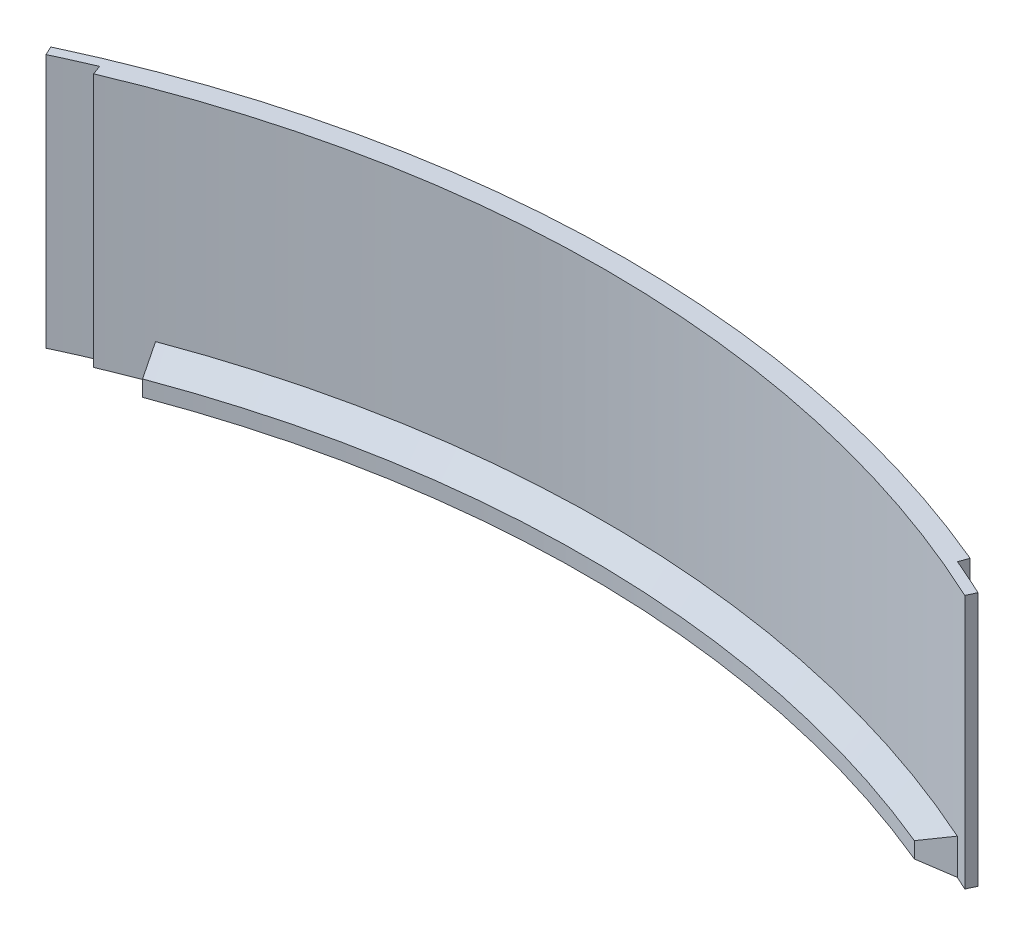
ISO-10303-21;
HEADER;
FILE_DESCRIPTION(('STEP AP214'),'2;1');
FILE_NAME('part.step','',(''),(''),'','','');
FILE_SCHEMA(('AUTOMOTIVE_DESIGN { 1 0 10303 214 1 1 1 1 }'));
ENDSEC;
DATA;
#1=APPLICATION_CONTEXT('core data for automotive mechanical design processes');
#2=APPLICATION_PROTOCOL_DEFINITION('international standard','automotive_design',2000,#1);
#3=PRODUCT_CONTEXT('',#1,'mechanical');
#4=PRODUCT('Part','Part','',(#3));
#5=PRODUCT_RELATED_PRODUCT_CATEGORY('part','',(#4));
#6=PRODUCT_DEFINITION_FORMATION('','',#4);
#7=PRODUCT_DEFINITION_CONTEXT('part definition',#1,'design');
#8=PRODUCT_DEFINITION('design','',#6,#7);
#9=PRODUCT_DEFINITION_SHAPE('','',#8);
#10=(LENGTH_UNIT() NAMED_UNIT(*) SI_UNIT(.MILLI.,.METRE.));
#11=(NAMED_UNIT(*) PLANE_ANGLE_UNIT() SI_UNIT($,.RADIAN.));
#12=(NAMED_UNIT(*) SI_UNIT($,.STERADIAN.) SOLID_ANGLE_UNIT());
#13=UNCERTAINTY_MEASURE_WITH_UNIT(LENGTH_MEASURE(1.E-05),#10,'distance_accuracy_value','');
#14=(GEOMETRIC_REPRESENTATION_CONTEXT(3) GLOBAL_UNCERTAINTY_ASSIGNED_CONTEXT((#13)) GLOBAL_UNIT_ASSIGNED_CONTEXT((#10,
#11,#12)) REPRESENTATION_CONTEXT('',''));
#15=CARTESIAN_POINT('',(0.,0.,0.));
#16=DIRECTION('',(0.,0.,1.));
#17=DIRECTION('',(1.,0.,0.));
#18=AXIS2_PLACEMENT_3D('',#15,#16,#17);
#19=CARTESIAN_POINT('',(0.,16.,-0.655417058189309));
#20=DIRECTION('',(0.,-1.,0.));
#21=DIRECTION('',(0.,0.,-1.));
#22=AXIS2_PLACEMENT_3D('',#19,#20,#21);
#23=CYLINDRICAL_SURFACE('',#22,138.155417058189);
#24=CARTESIAN_POINT('',(0.,-16.,-0.655417058189309));
#25=DIRECTION('',(0.,-1.,0.));
#26=DIRECTION('',(0.,0.,-1.));
#27=AXIS2_PLACEMENT_3D('',#24,#25,#26);
#28=CIRCLE('',#27,138.155417058189);
#29=CARTESIAN_POINT('',(-58.6379241549536,-16.,-125.749434154612));
#30=VERTEX_POINT('',#29);
#31=CARTESIAN_POINT('',(-53.9719536652918,-16.,-127.832252527837));
#32=VERTEX_POINT('',#31);
#33=EDGE_CURVE('E215',#30,#32,#28,.T.);
#34=ORIENTED_EDGE('',*,*,#33,.T.);
#35=DIRECTION('',(0.,-1.,0.));
#36=VECTOR('',#35,1.);
#37=CARTESIAN_POINT('',(-53.9719536652918,16.,-127.832252527837));
#38=LINE('',#37,#36);
#39=CARTESIAN_POINT('',(-53.9719536652918,16.,-127.832252527837));
#40=VERTEX_POINT('',#39);
#41=EDGE_CURVE('E272',#40,#32,#38,.T.);
#42=ORIENTED_EDGE('',*,*,#41,.F.);
#43=CARTESIAN_POINT('',(0.,16.,-0.655417058189309));
#44=DIRECTION('',(0.,-1.,0.));
#45=DIRECTION('',(0.,0.,-1.));
#46=AXIS2_PLACEMENT_3D('',#43,#44,#45);
#47=CIRCLE('',#46,138.155417058189);
#48=CARTESIAN_POINT('',(-58.6379241549536,16.,-125.749434154612));
#49=VERTEX_POINT('',#48);
#50=EDGE_CURVE('E216',#49,#40,#47,.T.);
#51=ORIENTED_EDGE('',*,*,#50,.F.);
#52=DIRECTION('',(0.,-1.,0.));
#53=VECTOR('',#52,1.);
#54=CARTESIAN_POINT('',(-58.6379241549536,16.,-125.749434154612));
#55=LINE('',#54,#53);
#56=EDGE_CURVE('E234',#49,#30,#55,.T.);
#57=ORIENTED_EDGE('',*,*,#56,.T.);
#58=EDGE_LOOP('',(#34,#42,#51,#57));
#59=FACE_BOUND('',#58,.T.);
#60=ADVANCED_FACE('F37',(#59),#23,.F.);
#61=CARTESIAN_POINT('',(-53.9719536652918,16.,-127.832252527837));
#62=DIRECTION('',(0.939692620785906,0.,-0.342020143325674));
#63=DIRECTION('',(-0.342020143325674,0.,-0.939692620785906));
#64=AXIS2_PLACEMENT_3D('',#61,#62,#63);
#65=PLANE('',#64);
#66=DIRECTION('',(0.342020143325674,0.,0.939692620785906));
#67=VECTOR('',#66,1.);
#68=CARTESIAN_POINT('',(-53.9719536652918,-16.,-127.832252527837));
#69=LINE('',#68,#67);
#70=CARTESIAN_POINT('',(-53.5408012887989,-16.,-126.647671109079));
#71=VERTEX_POINT('',#70);
#72=EDGE_CURVE('E237',#32,#71,#69,.T.);
#73=ORIENTED_EDGE('',*,*,#72,.T.);
#74=DIRECTION('',(0.,-1.,0.));
#75=VECTOR('',#74,1.);
#76=CARTESIAN_POINT('',(-53.5408012887989,16.,-126.647671109079));
#77=LINE('',#76,#75);
#78=CARTESIAN_POINT('',(-53.5408012887989,16.,-126.647671109079));
#79=VERTEX_POINT('',#78);
#80=EDGE_CURVE('E270',#79,#71,#77,.T.);
#81=ORIENTED_EDGE('',*,*,#80,.F.);
#82=DIRECTION('',(0.342020143325674,0.,0.939692620785906));
#83=VECTOR('',#82,1.);
#84=CARTESIAN_POINT('',(-53.9719536652918,16.,-127.832252527837));
#85=LINE('',#84,#83);
#86=EDGE_CURVE('E219',#40,#79,#85,.T.);
#87=ORIENTED_EDGE('',*,*,#86,.F.);
#88=ORIENTED_EDGE('',*,*,#41,.T.);
#89=EDGE_LOOP('',(#73,#81,#87,#88));
#90=FACE_BOUND('',#89,.T.);
#91=ADVANCED_FACE('F297',(#90),#65,.F.);
#92=CARTESIAN_POINT('',(0.,16.,0.));
#93=DIRECTION('',(0.,-1.,0.));
#94=DIRECTION('',(0.,0.,-1.));
#95=AXIS2_PLACEMENT_3D('',#92,#93,#94);
#96=CYLINDRICAL_SURFACE('',#95,137.5);
#97=DIRECTION('',(0.,-1.,0.));
#98=VECTOR('',#97,1.);
#99=CARTESIAN_POINT('',(-47.9655484846176,-14.,-128.862547540276));
#100=LINE('',#99,#98);
#101=CARTESIAN_POINT('',(-47.9655484846176,-11.5,-128.862547540276));
#102=VERTEX_POINT('',#101);
#103=CARTESIAN_POINT('',(-47.9655484846176,-16.,-128.862547540276));
#104=VERTEX_POINT('',#103);
#105=EDGE_CURVE('E179',#102,#104,#100,.T.);
#106=ORIENTED_EDGE('',*,*,#105,.F.);
#107=CARTESIAN_POINT('',(0.,-11.5,0.));
#108=DIRECTION('',(0.,-1.,0.));
#109=DIRECTION('',(0.,0.,-1.));
#110=AXIS2_PLACEMENT_3D('',#107,#108,#109);
#111=CIRCLE('',#110,137.5);
#112=CARTESIAN_POINT('',(56.3667257732418,-11.5,-125.415478413169));
#113=VERTEX_POINT('',#112);
#114=EDGE_CURVE('E165',#102,#113,#111,.T.);
#115=ORIENTED_EDGE('',*,*,#114,.T.);
#116=DIRECTION('',(0.,-1.,0.));
#117=VECTOR('',#116,1.);
#118=CARTESIAN_POINT('',(56.3667257732418,16.,-125.415478413169));
#119=LINE('',#118,#117);
#120=CARTESIAN_POINT('',(56.3667257732418,-16.,-125.415478413169));
#121=VERTEX_POINT('',#120);
#122=EDGE_CURVE('E212',#113,#121,#119,.T.);
#123=ORIENTED_EDGE('',*,*,#122,.T.);
#124=CARTESIAN_POINT('',(0.,-16.,0.));
#125=DIRECTION('',(0.,-1.,0.));
#126=DIRECTION('',(0.,0.,1.));
#127=AXIS2_PLACEMENT_3D('',#124,#125,#126);
#128=CIRCLE('',#127,137.5);
#129=CARTESIAN_POINT('',(58.1100109893463,-16.,-124.617320717539));
#130=VERTEX_POINT('',#129);
#131=EDGE_CURVE('E240',#121,#130,#128,.T.);
#132=ORIENTED_EDGE('',*,*,#131,.T.);
#133=DIRECTION('',(0.,-1.,0.));
#134=VECTOR('',#133,1.);
#135=CARTESIAN_POINT('',(58.1100109893463,16.,-124.617320717539));
#136=LINE('',#135,#134);
#137=CARTESIAN_POINT('',(58.1100109893463,16.,-124.617320717539));
#138=VERTEX_POINT('',#137);
#139=EDGE_CURVE('E267',#138,#130,#136,.T.);
#140=ORIENTED_EDGE('',*,*,#139,.F.);
#141=CARTESIAN_POINT('',(0.,16.,0.));
#142=DIRECTION('',(0.,-1.,0.));
#143=DIRECTION('',(0.,0.,1.));
#144=AXIS2_PLACEMENT_3D('',#141,#142,#143);
#145=CIRCLE('',#144,137.5);
#146=EDGE_CURVE('E222',#79,#138,#145,.T.);
#147=ORIENTED_EDGE('',*,*,#146,.F.);
#148=ORIENTED_EDGE('',*,*,#80,.T.);
#149=EDGE_CURVE('E241',#71,#104,#128,.T.);
#150=ORIENTED_EDGE('',*,*,#149,.T.);
#151=EDGE_LOOP('',(#106,#115,#123,#132,#140,#147,#148,#150));
#152=FACE_BOUND('',#151,.T.);
#153=ADVANCED_FACE('F301',(#152),#96,.F.);
#154=CARTESIAN_POINT('',(58.1100109893463,16.,-124.617320717539));
#155=DIRECTION('',(-0.906307787036644,0.,-0.422618261740712));
#156=DIRECTION('',(-0.422618261740712,0.,0.906307787036644));
#157=AXIS2_PLACEMENT_3D('',#154,#155,#156);
#158=PLANE('',#157);
#159=DIRECTION('',(0.422618261740712,0.,-0.906307787036644));
#160=VECTOR('',#159,1.);
#161=CARTESIAN_POINT('',(58.1100109893463,-16.,-124.617320717539));
#162=LINE('',#161,#160);
#163=CARTESIAN_POINT('',(58.6379241549536,-16.,-125.749434154612));
#164=VERTEX_POINT('',#163);
#165=EDGE_CURVE('E243',#130,#164,#162,.T.);
#166=ORIENTED_EDGE('',*,*,#165,.T.);
#167=DIRECTION('',(0.,-1.,0.));
#168=VECTOR('',#167,1.);
#169=CARTESIAN_POINT('',(58.6379241549536,16.,-125.749434154612));
#170=LINE('',#169,#168);
#171=CARTESIAN_POINT('',(58.6379241549536,16.,-125.749434154612));
#172=VERTEX_POINT('',#171);
#173=EDGE_CURVE('E265',#172,#164,#170,.T.);
#174=ORIENTED_EDGE('',*,*,#173,.F.);
#175=DIRECTION('',(0.422618261740712,0.,-0.906307787036644));
#176=VECTOR('',#175,1.);
#177=CARTESIAN_POINT('',(58.1100109893463,16.,-124.617320717539));
#178=LINE('',#177,#176);
#179=EDGE_CURVE('E224',#138,#172,#178,.T.);
#180=ORIENTED_EDGE('',*,*,#179,.F.);
#181=ORIENTED_EDGE('',*,*,#139,.T.);
#182=EDGE_LOOP('',(#166,#174,#180,#181));
#183=FACE_BOUND('',#182,.T.);
#184=ADVANCED_FACE('F305',(#183),#158,.F.);
#185=CARTESIAN_POINT('',(0.,16.,-0.655417058189309));
#186=DIRECTION('',(0.,-1.,0.));
#187=DIRECTION('',(0.,0.,-1.));
#188=AXIS2_PLACEMENT_3D('',#185,#186,#187);
#189=CYLINDRICAL_SURFACE('',#188,138.155417058189);
#190=CARTESIAN_POINT('',(0.,-16.,-0.655417058189309));
#191=DIRECTION('',(0.,1.,0.));
#192=DIRECTION('',(0.,0.,-1.));
#193=AXIS2_PLACEMENT_3D('',#190,#191,#192);
#194=CIRCLE('',#193,138.155417058189);
#195=CARTESIAN_POINT('',(53.9719536652918,-16.,-127.832252527837));
#196=VERTEX_POINT('',#195);
#197=EDGE_CURVE('E246',#164,#196,#194,.T.);
#198=ORIENTED_EDGE('',*,*,#197,.T.);
#199=DIRECTION('',(0.,-1.,0.));
#200=VECTOR('',#199,1.);
#201=CARTESIAN_POINT('',(53.9719536652918,16.,-127.832252527837));
#202=LINE('',#201,#200);
#203=CARTESIAN_POINT('',(53.9719536652918,16.,-127.832252527837));
#204=VERTEX_POINT('',#203);
#205=EDGE_CURVE('E263',#204,#196,#202,.T.);
#206=ORIENTED_EDGE('',*,*,#205,.F.);
#207=CARTESIAN_POINT('',(0.,16.,-0.655417058189309));
#208=DIRECTION('',(0.,1.,0.));
#209=DIRECTION('',(0.,0.,-1.));
#210=AXIS2_PLACEMENT_3D('',#207,#208,#209);
#211=CIRCLE('',#210,138.155417058189);
#212=EDGE_CURVE('E226',#172,#204,#211,.T.);
#213=ORIENTED_EDGE('',*,*,#212,.F.);
#214=ORIENTED_EDGE('',*,*,#173,.T.);
#215=EDGE_LOOP('',(#198,#206,#213,#214));
#216=FACE_BOUND('',#215,.T.);
#217=ADVANCED_FACE('F309',(#216),#189,.T.);
#218=CARTESIAN_POINT('',(53.9719536652918,16.,-127.832252527837));
#219=DIRECTION('',(-0.939692620785907,0.,-0.342020143325673));
#220=DIRECTION('',(-0.342020143325673,0.,0.939692620785907));
#221=AXIS2_PLACEMENT_3D('',#218,#219,#220);
#222=PLANE('',#221);
#223=DIRECTION('',(0.342020143325673,0.,-0.939692620785907));
#224=VECTOR('',#223,1.);
#225=CARTESIAN_POINT('',(53.9719536652918,-16.,-127.832252527837));
#226=LINE('',#225,#224);
#227=CARTESIAN_POINT('',(54.3969406775952,-16.,-128.999894747702));
#228=VERTEX_POINT('',#227);
#229=EDGE_CURVE('E249',#196,#228,#226,.T.);
#230=ORIENTED_EDGE('',*,*,#229,.T.);
#231=DIRECTION('',(0.,-1.,0.));
#232=VECTOR('',#231,1.);
#233=CARTESIAN_POINT('',(54.3969406775952,16.,-128.999894747702));
#234=LINE('',#233,#232);
#235=CARTESIAN_POINT('',(54.3969406775952,16.,-128.999894747702));
#236=VERTEX_POINT('',#235);
#237=EDGE_CURVE('E261',#236,#228,#234,.T.);
#238=ORIENTED_EDGE('',*,*,#237,.F.);
#239=DIRECTION('',(0.342020143325673,0.,-0.939692620785907));
#240=VECTOR('',#239,1.);
#241=CARTESIAN_POINT('',(53.9719536652918,16.,-127.832252527837));
#242=LINE('',#241,#240);
#243=EDGE_CURVE('E228',#204,#236,#242,.T.);
#244=ORIENTED_EDGE('',*,*,#243,.F.);
#245=ORIENTED_EDGE('',*,*,#205,.T.);
#246=EDGE_LOOP('',(#230,#238,#244,#245));
#247=FACE_BOUND('',#246,.T.);
#248=ADVANCED_FACE('F313',(#247),#222,.F.);
#249=CARTESIAN_POINT('',(0.,16.,0.));
#250=DIRECTION('',(0.,-1.,0.));
#251=DIRECTION('',(0.,0.,-1.));
#252=AXIS2_PLACEMENT_3D('',#249,#250,#251);
#253=CYLINDRICAL_SURFACE('',#252,140.);
#254=DIRECTION('',(0.,-1.,0.));
#255=VECTOR('',#254,1.);
#256=CARTESIAN_POINT('',(48.7182704643577,-14.,-131.249876658844));
#257=LINE('',#256,#255);
#258=CARTESIAN_POINT('',(48.7182704643577,-11.5,-131.249876658844));
#259=VERTEX_POINT('',#258);
#260=CARTESIAN_POINT('',(48.7182704643577,-16.,-131.249876658844));
#261=VERTEX_POINT('',#260);
#262=EDGE_CURVE('E59',#259,#261,#257,.T.);
#263=ORIENTED_EDGE('',*,*,#262,.F.);
#264=CARTESIAN_POINT('',(0.,-11.5,0.));
#265=DIRECTION('',(0.,-1.,0.));
#266=DIRECTION('',(0.,0.,-1.));
#267=AXIS2_PLACEMENT_3D('',#264,#265,#266);
#268=CIRCLE('',#267,140.);
#269=CARTESIAN_POINT('',(-57.2357074034177,-11.5,-127.765698832004));
#270=VERTEX_POINT('',#269);
#271=EDGE_CURVE('E169',#259,#270,#268,.F.);
#272=ORIENTED_EDGE('',*,*,#271,.T.);
#273=DIRECTION('',(0.,-1.,0.));
#274=VECTOR('',#273,1.);
#275=CARTESIAN_POINT('',(-57.2357074034177,16.,-127.765698832004));
#276=LINE('',#275,#274);
#277=CARTESIAN_POINT('',(-57.2357074034177,-16.,-127.765698832004));
#278=VERTEX_POINT('',#277);
#279=EDGE_CURVE('E66',#270,#278,#276,.T.);
#280=ORIENTED_EDGE('',*,*,#279,.T.);
#281=CARTESIAN_POINT('',(0.,-16.,0.));
#282=DIRECTION('',(0.,1.,0.));
#283=DIRECTION('',(0.,0.,1.));
#284=AXIS2_PLACEMENT_3D('',#281,#282,#283);
#285=CIRCLE('',#284,140.);
#286=CARTESIAN_POINT('',(-59.1665566436981,-16.,-126.883090185131));
#287=VERTEX_POINT('',#286);
#288=EDGE_CURVE('E252',#278,#287,#285,.T.);
#289=ORIENTED_EDGE('',*,*,#288,.T.);
#290=DIRECTION('',(0.,-1.,0.));
#291=VECTOR('',#290,1.);
#292=CARTESIAN_POINT('',(-59.1665566436981,16.,-126.883090185131));
#293=LINE('',#292,#291);
#294=CARTESIAN_POINT('',(-59.1665566436981,16.,-126.883090185131));
#295=VERTEX_POINT('',#294);
#296=EDGE_CURVE('E258',#295,#287,#293,.T.);
#297=ORIENTED_EDGE('',*,*,#296,.F.);
#298=CARTESIAN_POINT('',(0.,16.,0.));
#299=DIRECTION('',(0.,1.,0.));
#300=DIRECTION('',(0.,0.,1.));
#301=AXIS2_PLACEMENT_3D('',#298,#299,#300);
#302=CIRCLE('',#301,140.);
#303=EDGE_CURVE('E230',#236,#295,#302,.T.);
#304=ORIENTED_EDGE('',*,*,#303,.F.);
#305=ORIENTED_EDGE('',*,*,#237,.T.);
#306=EDGE_CURVE('E253',#228,#261,#285,.T.);
#307=ORIENTED_EDGE('',*,*,#306,.T.);
#308=EDGE_LOOP('',(#263,#272,#280,#289,#297,#304,#305,#307));
#309=FACE_BOUND('',#308,.T.);
#310=ADVANCED_FACE('F317',(#309),#253,.T.);
#311=CARTESIAN_POINT('',(-58.6379241549536,16.,-125.749434154612));
#312=DIRECTION('',(0.906307787036654,0.,-0.422618261740691));
#313=DIRECTION('',(-0.422618261740691,0.,-0.906307787036654));
#314=AXIS2_PLACEMENT_3D('',#311,#312,#313);
#315=PLANE('',#314);
#316=DIRECTION('',(0.422618261740691,0.,0.906307787036654));
#317=VECTOR('',#316,1.);
#318=CARTESIAN_POINT('',(-58.6379241549536,-16.,-125.749434154612));
#319=LINE('',#318,#317);
#320=EDGE_CURVE('E220',#287,#30,#319,.T.);
#321=ORIENTED_EDGE('',*,*,#320,.T.);
#322=ORIENTED_EDGE('',*,*,#56,.F.);
#323=DIRECTION('',(0.422618261740691,0.,0.906307787036654));
#324=VECTOR('',#323,1.);
#325=CARTESIAN_POINT('',(-58.6379241549536,16.,-125.749434154612));
#326=LINE('',#325,#324);
#327=EDGE_CURVE('E232',#295,#49,#326,.T.);
#328=ORIENTED_EDGE('',*,*,#327,.F.);
#329=ORIENTED_EDGE('',*,*,#296,.T.);
#330=EDGE_LOOP('',(#321,#322,#328,#329));
#331=FACE_BOUND('',#330,.T.);
#332=ADVANCED_FACE('F321',(#331),#315,.F.);
#333=CARTESIAN_POINT('',(0.,16.,-0.655417058189309));
#334=DIRECTION('',(0.,-1.,0.));
#335=DIRECTION('',(0.,0.,-1.));
#336=AXIS2_PLACEMENT_3D('',#333,#334,#335);
#337=PLANE('',#336);
#338=ORIENTED_EDGE('',*,*,#50,.T.);
#339=ORIENTED_EDGE('',*,*,#86,.T.);
#340=ORIENTED_EDGE('',*,*,#146,.T.);
#341=ORIENTED_EDGE('',*,*,#179,.T.);
#342=ORIENTED_EDGE('',*,*,#212,.T.);
#343=ORIENTED_EDGE('',*,*,#243,.T.);
#344=ORIENTED_EDGE('',*,*,#303,.T.);
#345=ORIENTED_EDGE('',*,*,#327,.T.);
#346=EDGE_LOOP('',(#338,#339,#340,#341,#342,#343,#344,#345));
#347=FACE_BOUND('',#346,.T.);
#348=ADVANCED_FACE('F324',(#347),#337,.F.);
#349=CARTESIAN_POINT('',(0.,-16.,-0.655417058189309));
#350=DIRECTION('',(0.,-1.,0.));
#351=DIRECTION('',(0.,0.,-1.));
#352=AXIS2_PLACEMENT_3D('',#349,#350,#351);
#353=PLANE('',#352);
#354=ORIENTED_EDGE('',*,*,#288,.F.);
#355=DIRECTION('',(0.570954134905262,0.,-0.820981958288113));
#356=VECTOR('',#355,1.);
#357=CARTESIAN_POINT('',(-98.4668004534024,-16.,-68.4790040782257));
#358=LINE('',#357,#356);
#359=CARTESIAN_POINT('',(-54.5323891120253,-16.,-131.652833382858));
#360=VERTEX_POINT('',#359);
#361=EDGE_CURVE('E196',#278,#360,#358,.T.);
#362=ORIENTED_EDGE('',*,*,#361,.T.);
#363=CARTESIAN_POINT('',(0.,-16.,0.));
#364=DIRECTION('',(0.,-1.,0.));
#365=DIRECTION('',(0.,0.,-1.));
#366=AXIS2_PLACEMENT_3D('',#363,#364,#365);
#367=CIRCLE('',#366,142.5);
#368=CARTESIAN_POINT('',(49.4709587863074,-16.,-133.637099028539));
#369=VERTEX_POINT('',#368);
#370=EDGE_CURVE('E198',#360,#369,#367,.T.);
#371=ORIENTED_EDGE('',*,*,#370,.T.);
#372=DIRECTION('',(0.300705799504267,0.,-0.953716950748229));
#373=VECTOR('',#372,1.);
#374=CARTESIAN_POINT('',(6.67205239198405,-16.,2.10369003852965));
#375=LINE('',#374,#373);
#376=EDGE_CURVE('E190',#261,#369,#375,.T.);
#377=ORIENTED_EDGE('',*,*,#376,.F.);
#378=ORIENTED_EDGE('',*,*,#306,.F.);
#379=ORIENTED_EDGE('',*,*,#229,.F.);
#380=ORIENTED_EDGE('',*,*,#197,.F.);
#381=ORIENTED_EDGE('',*,*,#165,.F.);
#382=ORIENTED_EDGE('',*,*,#131,.F.);
#383=DIRECTION('',(-0.989361895477558,0.,0.145475220491512));
#384=VECTOR('',#383,1.);
#385=CARTESIAN_POINT('',(-16.8578625541037,-16.,-114.648575845956));
#386=LINE('',#385,#384);
#387=CARTESIAN_POINT('',(51.6622633692871,-16.,-124.723736889024));
#388=VERTEX_POINT('',#387);
#389=EDGE_CURVE('E186',#121,#388,#386,.T.);
#390=ORIENTED_EDGE('',*,*,#389,.T.);
#391=CARTESIAN_POINT('',(0.,-16.,0.));
#392=DIRECTION('',(0.,-1.,0.));
#393=DIRECTION('',(0.,0.,-1.));
#394=AXIS2_PLACEMENT_3D('',#391,#392,#393);
#395=CIRCLE('',#394,135.);
#396=CARTESIAN_POINT('',(-47.2127909723094,-16.,-126.475105726799));
#397=VERTEX_POINT('',#396);
#398=EDGE_CURVE('E193',#397,#388,#395,.T.);
#399=ORIENTED_EDGE('',*,*,#398,.F.);
#400=DIRECTION('',(0.300705799504292,0.,0.953716950748221));
#401=VECTOR('',#400,1.);
#402=CARTESIAN_POINT('',(-6.67205239198046,-16.,2.10369003852871));
#403=LINE('',#402,#401);
#404=EDGE_CURVE('E175',#104,#397,#403,.T.);
#405=ORIENTED_EDGE('',*,*,#404,.F.);
#406=ORIENTED_EDGE('',*,*,#149,.F.);
#407=ORIENTED_EDGE('',*,*,#72,.F.);
#408=ORIENTED_EDGE('',*,*,#33,.F.);
#409=ORIENTED_EDGE('',*,*,#320,.F.);
#410=EDGE_LOOP('',(#354,#362,#371,#377,#378,#379,#380,#381,#382,#390,#399,#405,#406,#407,#408,#409));
#411=FACE_BOUND('',#410,.T.);
#412=ADVANCED_FACE('F326',(#411),#353,.T.);
#413=CARTESIAN_POINT('',(0.,-14.,0.));
#414=DIRECTION('',(0.,-1.,0.));
#415=DIRECTION('',(0.,0.,-1.));
#416=AXIS2_PLACEMENT_3D('',#413,#414,#415);
#417=CYLINDRICAL_SURFACE('',#416,142.5);
#418=ORIENTED_EDGE('',*,*,#370,.F.);
#419=DIRECTION('',(0.,-1.,0.));
#420=VECTOR('',#419,1.);
#421=CARTESIAN_POINT('',(-54.5323891120253,-14.,-131.652833382858));
#422=LINE('',#421,#420);
#423=CARTESIAN_POINT('',(-54.5323891120253,-14.,-131.652833382858));
#424=VERTEX_POINT('',#423);
#425=EDGE_CURVE('E207',#424,#360,#422,.T.);
#426=ORIENTED_EDGE('',*,*,#425,.F.);
#427=CARTESIAN_POINT('',(0.,-14.,0.));
#428=DIRECTION('',(0.,-1.,0.));
#429=DIRECTION('',(0.,0.,-1.));
#430=AXIS2_PLACEMENT_3D('',#427,#428,#429);
#431=CIRCLE('',#430,142.5);
#432=CARTESIAN_POINT('',(49.4709587863074,-14.,-133.637099028539));
#433=VERTEX_POINT('',#432);
#434=EDGE_CURVE('E180',#424,#433,#431,.T.);
#435=ORIENTED_EDGE('',*,*,#434,.T.);
#436=DIRECTION('',(0.,-1.,0.));
#437=VECTOR('',#436,1.);
#438=CARTESIAN_POINT('',(49.4709587863074,-14.,-133.637099028539));
#439=LINE('',#438,#437);
#440=EDGE_CURVE('E205',#433,#369,#439,.T.);
#441=ORIENTED_EDGE('',*,*,#440,.T.);
#442=EDGE_LOOP('',(#418,#426,#435,#441));
#443=FACE_BOUND('',#442,.T.);
#444=ADVANCED_FACE('F329',(#443),#417,.T.);
#445=CARTESIAN_POINT('',(-98.4668004534024,-14.,-68.4790040782257));
#446=DIRECTION('',(-0.820981958288113,0.,-0.570954134905262));
#447=DIRECTION('',(-0.570954134905262,0.,0.820981958288113));
#448=AXIS2_PLACEMENT_3D('',#445,#446,#447);
#449=PLANE('',#448);
#450=ORIENTED_EDGE('',*,*,#279,.F.);
#451=CARTESIAN_POINT('',(-57.2357074034177,-11.5,-127.765698832004));
#452=CARTESIAN_POINT('',(-57.0092951643545,-11.7045477101286,-128.091259769464));
#453=CARTESIAN_POINT('',(-56.7831706074317,-11.9100717501878,-128.416407045244));
#454=CARTESIAN_POINT('',(-56.3314953219054,-12.3230237039518,-129.065876482019));
#455=CARTESIAN_POINT('',(-56.1059445805967,-12.5304515750255,-129.390198661285));
#456=CARTESIAN_POINT('',(-55.6554054171037,-12.9471714161661,-130.038034454244));
#457=CARTESIAN_POINT('',(-55.4304169945668,-13.1564633850636,-130.361548068446));
#458=CARTESIAN_POINT('',(-54.9809906093723,-13.5768736798418,-131.007783783832));
#459=CARTESIAN_POINT('',(-54.7565526591234,-13.7879920464158,-131.330505867175));
#460=CARTESIAN_POINT('',(-54.5323891120253,-14.,-131.652833382858));
#461=B_SPLINE_CURVE_WITH_KNOTS('',3,(#451,#452,#453,#454,#455,#456,#457,#458,#459,#460),
.UNSPECIFIED.,.F.,.F.,(4,2,2,2,4),(0.,1.3385907640308,2.67715162683458,4.0157116500314,
5.35430157433936),.UNSPECIFIED.);
#462=EDGE_CURVE('E11',#270,#424,#461,.T.);
#463=ORIENTED_EDGE('',*,*,#462,.T.);
#464=ORIENTED_EDGE('',*,*,#425,.T.);
#465=ORIENTED_EDGE('',*,*,#361,.F.);
#466=EDGE_LOOP('',(#450,#463,#464,#465));
#467=FACE_BOUND('',#466,.T.);
#468=ADVANCED_FACE('F344',(#467),#449,.T.);
#469=CARTESIAN_POINT('',(6.67205239198405,-14.,2.10369003852965));
#470=DIRECTION('',(-0.953716950748229,0.,-0.300705799504267));
#471=DIRECTION('',(-0.300705799504267,0.,0.953716950748229));
#472=AXIS2_PLACEMENT_3D('',#469,#470,#471);
#473=PLANE('',#472);
#474=ORIENTED_EDGE('',*,*,#376,.T.);
#475=ORIENTED_EDGE('',*,*,#440,.F.);
#476=CARTESIAN_POINT('',(49.4709587863074,-14.,-133.637099028539));
#477=CARTESIAN_POINT('',(49.3455120960564,-13.5833287937379,-133.239232957765));
#478=CARTESIAN_POINT('',(49.2200647241018,-13.1666598572735,-132.841364724904));
#479=CARTESIAN_POINT('',(48.9691686167852,-12.3333265239402,-132.045623935005));
#480=CARTESIAN_POINT('',(48.8437198814233,-11.9166621270712,-131.647751377968));
#481=CARTESIAN_POINT('',(48.7182704643577,-11.5,-131.249876658844));
#482=B_SPLINE_CURVE_WITH_KNOTS('',3,(#476,#477,#478,#479,#480,#481),.UNSPECIFIED.,.F.,.F.,(4,2,
4),(0.,1.76885346713173,3.5377069342644),.UNSPECIFIED.);
#483=EDGE_CURVE('E52',#433,#259,#482,.T.);
#484=ORIENTED_EDGE('',*,*,#483,.T.);
#485=ORIENTED_EDGE('',*,*,#262,.T.);
#486=EDGE_LOOP('',(#474,#475,#484,#485));
#487=FACE_BOUND('',#486,.T.);
#488=ADVANCED_FACE('F339',(#487),#473,.F.);
#489=CARTESIAN_POINT('',(-16.8578625541037,-14.,-114.648575845956));
#490=DIRECTION('',(0.145475220491512,0.,0.989361895477558));
#491=DIRECTION('',(0.989361895477558,0.,-0.145475220491512));
#492=AXIS2_PLACEMENT_3D('',#489,#490,#491);
#493=PLANE('',#492);
#494=ORIENTED_EDGE('',*,*,#122,.F.);
#495=CARTESIAN_POINT('',(56.3667257732418,-11.5,-125.415478413169));
#496=CARTESIAN_POINT('',(55.9767048444645,-11.7121931755445,-125.358129953653));
#497=CARTESIAN_POINT('',(55.586186666963,-11.9234531181776,-125.300708378961));
#498=CARTESIAN_POINT('',(54.8041528662755,-12.3440549379991,-125.185718565722));
#499=CARTESIAN_POINT('',(54.4126372677253,-12.5533968619858,-125.128150330797));
#500=CARTESIAN_POINT('',(53.6285863151824,-12.9701215803462,-125.012863916676));
#501=CARTESIAN_POINT('',(53.2360509604633,-13.1775043733237,-124.955145737373));
#502=CARTESIAN_POINT('',(52.4499388882839,-13.5902674624146,-124.839556257372));
#503=CARTESIAN_POINT('',(52.0563621455814,-13.7956477094125,-124.781684952962));
#504=CARTESIAN_POINT('',(51.6622633692871,-14.,-124.723736889024));
#505=B_SPLINE_CURVE_WITH_KNOTS('',3,(#495,#496,#497,#498,#499,#500,#501,#502,#503,#504),
.UNSPECIFIED.,.F.,.F.,(4,2,2,2,4),(0.,1.34308509220198,2.68613732645033,4.02919051784933,
5.37227656734445),.UNSPECIFIED.);
#506=CARTESIAN_POINT('',(51.6622633692871,-14.,-124.723736889024));
#507=VERTEX_POINT('',#506);
#508=EDGE_CURVE('E168',#113,#507,#505,.T.);
#509=ORIENTED_EDGE('',*,*,#508,.T.);
#510=DIRECTION('',(0.,-1.,0.));
#511=VECTOR('',#510,1.);
#512=CARTESIAN_POINT('',(51.6622633692871,-14.,-124.723736889024));
#513=LINE('',#512,#511);
#514=EDGE_CURVE('E185',#507,#388,#513,.T.);
#515=ORIENTED_EDGE('',*,*,#514,.T.);
#516=ORIENTED_EDGE('',*,*,#389,.F.);
#517=EDGE_LOOP('',(#494,#509,#515,#516));
#518=FACE_BOUND('',#517,.T.);
#519=ADVANCED_FACE('F334',(#518),#493,.T.);
#520=CARTESIAN_POINT('',(0.,-14.,0.));
#521=DIRECTION('',(0.,-1.,0.));
#522=DIRECTION('',(0.,0.,-1.));
#523=AXIS2_PLACEMENT_3D('',#520,#521,#522);
#524=CYLINDRICAL_SURFACE('',#523,135.);
#525=ORIENTED_EDGE('',*,*,#398,.T.);
#526=ORIENTED_EDGE('',*,*,#514,.F.);
#527=CARTESIAN_POINT('',(0.,-14.,0.));
#528=DIRECTION('',(0.,-1.,0.));
#529=DIRECTION('',(0.,0.,-1.));
#530=AXIS2_PLACEMENT_3D('',#527,#528,#529);
#531=CIRCLE('',#530,135.);
#532=CARTESIAN_POINT('',(-47.2127909723094,-14.,-126.475105726799));
#533=VERTEX_POINT('',#532);
#534=EDGE_CURVE('E163',#533,#507,#531,.T.);
#535=ORIENTED_EDGE('',*,*,#534,.F.);
#536=DIRECTION('',(0.,-1.,0.));
#537=VECTOR('',#536,1.);
#538=CARTESIAN_POINT('',(-47.2127909723094,-14.,-126.475105726799));
#539=LINE('',#538,#537);
#540=EDGE_CURVE('E172',#533,#397,#539,.T.);
#541=ORIENTED_EDGE('',*,*,#540,.T.);
#542=EDGE_LOOP('',(#525,#526,#535,#541));
#543=FACE_BOUND('',#542,.T.);
#544=ADVANCED_FACE('F183',(#543),#524,.F.);
#545=CARTESIAN_POINT('',(-6.67205239198046,-14.,2.10369003852871));
#546=DIRECTION('',(0.953716950748221,0.,-0.300705799504292));
#547=DIRECTION('',(-0.300705799504292,0.,-0.953716950748221));
#548=AXIS2_PLACEMENT_3D('',#545,#546,#547);
#549=PLANE('',#548);
#550=ORIENTED_EDGE('',*,*,#404,.T.);
#551=ORIENTED_EDGE('',*,*,#540,.F.);
#552=CARTESIAN_POINT('',(-47.2127909723094,-14.,-126.475105726799));
#553=CARTESIAN_POINT('',(-47.338252077065,-13.5833383926895,-126.873017514541));
#554=CARTESIAN_POINT('',(-47.4637124221351,-13.1666742557008,-127.270926892868));
#555=CARTESIAN_POINT('',(-47.7146315929045,-12.3333409223675,-128.066740830693));
#556=CARTESIAN_POINT('',(-47.8400904186038,-11.9166717260228,-128.464645390192));
#557=CARTESIAN_POINT('',(-47.9655484846176,-11.5,-128.862547540276));
#558=B_SPLINE_CURVE_WITH_KNOTS('',3,(#552,#553,#554,#555,#556,#557),.UNSPECIFIED.,.F.,.F.,(4,2,
4),(0.,1.76893486917556,3.53786973834996),.UNSPECIFIED.);
#559=EDGE_CURVE('E158',#533,#102,#558,.T.);
#560=ORIENTED_EDGE('',*,*,#559,.T.);
#561=ORIENTED_EDGE('',*,*,#105,.T.);
#562=EDGE_LOOP('',(#550,#551,#560,#561));
#563=FACE_BOUND('',#562,.T.);
#564=ADVANCED_FACE('F173',(#563),#549,.F.);
#565=CARTESIAN_POINT('',(0.,-14.,0.));
#566=DIRECTION('',(0.,1.,0.));
#567=DIRECTION('',(0.,0.,1.));
#568=AXIS2_PLACEMENT_3D('',#565,#566,#567);
#569=CONICAL_SURFACE('',#568,135.,0.785398163397446);
#570=ORIENTED_EDGE('',*,*,#508,.F.);
#571=ORIENTED_EDGE('',*,*,#114,.F.);
#572=ORIENTED_EDGE('',*,*,#559,.F.);
#573=ORIENTED_EDGE('',*,*,#534,.T.);
#574=EDGE_LOOP('',(#570,#571,#572,#573));
#575=FACE_BOUND('',#574,.T.);
#576=ADVANCED_FACE('F161',(#575),#569,.F.);
#577=CARTESIAN_POINT('',(0.,-14.,0.));
#578=DIRECTION('',(0.,-1.,0.));
#579=DIRECTION('',(0.,0.,-1.));
#580=AXIS2_PLACEMENT_3D('',#577,#578,#579);
#581=CONICAL_SURFACE('',#580,142.5,0.785398163397457);
#582=ORIENTED_EDGE('',*,*,#462,.F.);
#583=ORIENTED_EDGE('',*,*,#271,.F.);
#584=ORIENTED_EDGE('',*,*,#483,.F.);
#585=ORIENTED_EDGE('',*,*,#434,.F.);
#586=EDGE_LOOP('',(#582,#583,#584,#585));
#587=FACE_BOUND('',#586,.T.);
#588=ADVANCED_FACE('F40',(#587),#581,.T.);
#589=CLOSED_SHELL('',(#60,#91,#153,#184,#217,#248,#310,#332,#348,#412,#444,#468,#488,#519,#544,
#564,#576,#588));
#590=MANIFOLD_SOLID_BREP('B2',#589);
#591=ADVANCED_BREP_SHAPE_REPRESENTATION('',(#18,#590),#14);
#592=SHAPE_DEFINITION_REPRESENTATION(#9,#591);
ENDSEC;
END-ISO-10303-21;
